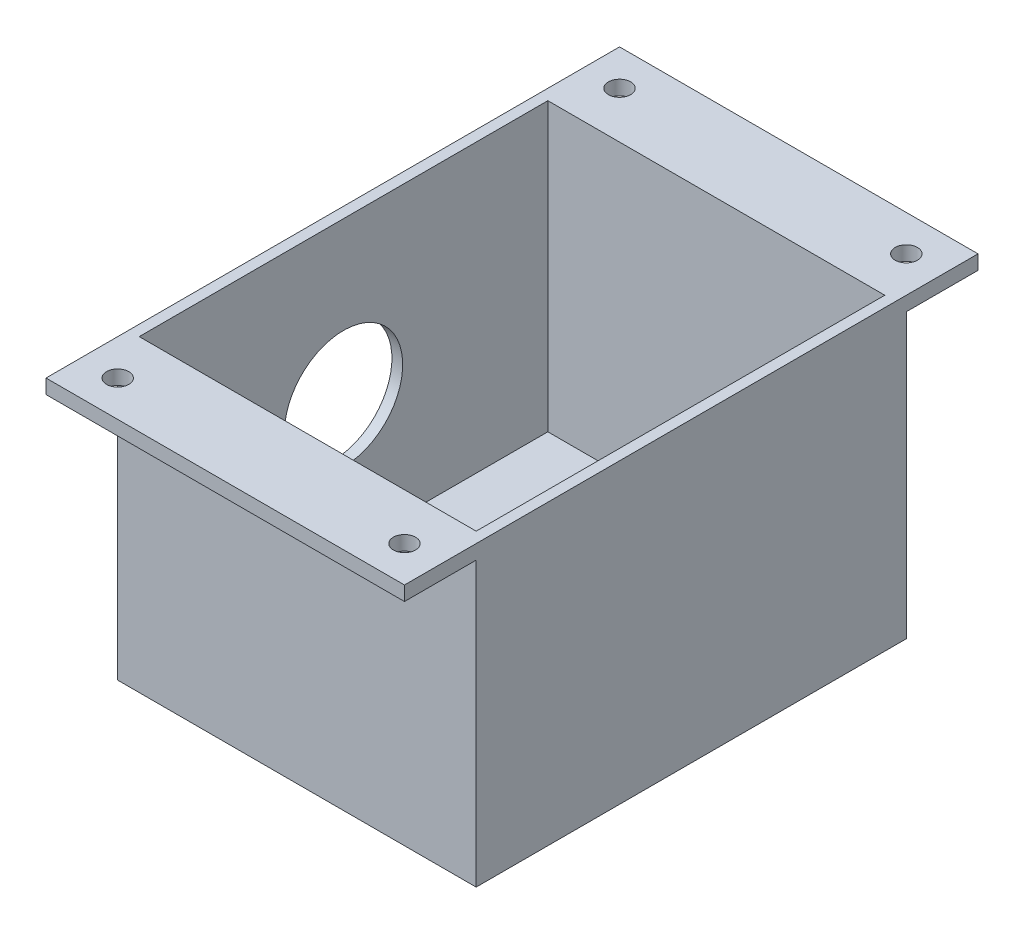
ISO-10303-21;
HEADER;
FILE_DESCRIPTION(('STEP AP214'),'2;1');
FILE_NAME('part.step','',(''),(''),'','','');
FILE_SCHEMA(('AUTOMOTIVE_DESIGN { 1 0 10303 214 1 1 1 1 }'));
ENDSEC;
DATA;
#1=APPLICATION_CONTEXT('core data for automotive mechanical design processes');
#2=APPLICATION_PROTOCOL_DEFINITION('international standard','automotive_design',2000,#1);
#3=PRODUCT_CONTEXT('',#1,'mechanical');
#4=PRODUCT('Part','Part','',(#3));
#5=PRODUCT_RELATED_PRODUCT_CATEGORY('part','',(#4));
#6=PRODUCT_DEFINITION_FORMATION('','',#4);
#7=PRODUCT_DEFINITION_CONTEXT('part definition',#1,'design');
#8=PRODUCT_DEFINITION('design','',#6,#7);
#9=PRODUCT_DEFINITION_SHAPE('','',#8);
#10=(LENGTH_UNIT() NAMED_UNIT(*) SI_UNIT(.MILLI.,.METRE.));
#11=(NAMED_UNIT(*) PLANE_ANGLE_UNIT() SI_UNIT($,.RADIAN.));
#12=(NAMED_UNIT(*) SI_UNIT($,.STERADIAN.) SOLID_ANGLE_UNIT());
#13=UNCERTAINTY_MEASURE_WITH_UNIT(LENGTH_MEASURE(1.E-05),#10,'distance_accuracy_value','');
#14=(GEOMETRIC_REPRESENTATION_CONTEXT(3) GLOBAL_UNCERTAINTY_ASSIGNED_CONTEXT((#13)) GLOBAL_UNIT_ASSIGNED_CONTEXT((#10,
#11,#12)) REPRESENTATION_CONTEXT('',''));
#15=CARTESIAN_POINT('',(0.,0.,0.));
#16=DIRECTION('',(0.,0.,1.));
#17=DIRECTION('',(1.,0.,0.));
#18=AXIS2_PLACEMENT_3D('',#15,#16,#17);
#19=CARTESIAN_POINT('',(0.,40.,-30.));
#20=DIRECTION('',(0.,0.,-1.));
#21=DIRECTION('',(-1.,0.,0.));
#22=AXIS2_PLACEMENT_3D('',#19,#20,#21);
#23=PLANE('',#22);
#24=DIRECTION('',(0.,-1.,0.));
#25=VECTOR('',#24,1.);
#26=CARTESIAN_POINT('',(-25.,40.,-30.));
#27=LINE('',#26,#25);
#28=CARTESIAN_POINT('',(-25.,38.,-30.));
#29=VERTEX_POINT('',#28);
#30=CARTESIAN_POINT('',(-25.,-1.5,-30.));
#31=VERTEX_POINT('',#30);
#32=EDGE_CURVE('E11',#29,#31,#27,.T.);
#33=ORIENTED_EDGE('',*,*,#32,.F.);
#34=DIRECTION('',(1.,0.,0.));
#35=VECTOR('',#34,1.);
#36=CARTESIAN_POINT('',(-25.,38.,-30.));
#37=LINE('',#36,#35);
#38=CARTESIAN_POINT('',(25.,38.,-30.));
#39=VERTEX_POINT('',#38);
#40=EDGE_CURVE('E164',#29,#39,#37,.T.);
#41=ORIENTED_EDGE('',*,*,#40,.T.);
#42=DIRECTION('',(0.,-1.,0.));
#43=VECTOR('',#42,1.);
#44=CARTESIAN_POINT('',(25.,40.,-30.));
#45=LINE('',#44,#43);
#46=CARTESIAN_POINT('',(25.,-1.5,-30.));
#47=VERTEX_POINT('',#46);
#48=EDGE_CURVE('E214',#39,#47,#45,.T.);
#49=ORIENTED_EDGE('',*,*,#48,.T.);
#50=DIRECTION('',(1.,0.,0.));
#51=VECTOR('',#50,1.);
#52=CARTESIAN_POINT('',(-25.,-1.5,-30.));
#53=LINE('',#52,#51);
#54=EDGE_CURVE('E183',#31,#47,#53,.T.);
#55=ORIENTED_EDGE('',*,*,#54,.F.);
#56=EDGE_LOOP('',(#33,#41,#49,#55));
#57=FACE_BOUND('',#56,.T.);
#58=ADVANCED_FACE('F42',(#57),#23,.T.);
#59=CARTESIAN_POINT('',(0.,40.,30.));
#60=DIRECTION('',(0.,0.,-1.));
#61=DIRECTION('',(-1.,0.,0.));
#62=AXIS2_PLACEMENT_3D('',#59,#60,#61);
#63=PLANE('',#62);
#64=DIRECTION('',(1.,0.,0.));
#65=VECTOR('',#64,1.);
#66=CARTESIAN_POINT('',(-25.,38.,30.));
#67=LINE('',#66,#65);
#68=CARTESIAN_POINT('',(-25.,38.,30.));
#69=VERTEX_POINT('',#68);
#70=CARTESIAN_POINT('',(25.,38.,30.));
#71=VERTEX_POINT('',#70);
#72=EDGE_CURVE('E67',#69,#71,#67,.T.);
#73=ORIENTED_EDGE('',*,*,#72,.F.);
#74=DIRECTION('',(0.,-1.,0.));
#75=VECTOR('',#74,1.);
#76=CARTESIAN_POINT('',(-25.,40.,30.));
#77=LINE('',#76,#75);
#78=CARTESIAN_POINT('',(-25.,-1.5,30.));
#79=VERTEX_POINT('',#78);
#80=EDGE_CURVE('E51',#69,#79,#77,.T.);
#81=ORIENTED_EDGE('',*,*,#80,.T.);
#82=DIRECTION('',(-1.,0.,0.));
#83=VECTOR('',#82,1.);
#84=CARTESIAN_POINT('',(-25.,-1.5,30.));
#85=LINE('',#84,#83);
#86=CARTESIAN_POINT('',(25.,-1.5,30.));
#87=VERTEX_POINT('',#86);
#88=EDGE_CURVE('E189',#87,#79,#85,.T.);
#89=ORIENTED_EDGE('',*,*,#88,.F.);
#90=DIRECTION('',(0.,-1.,0.));
#91=VECTOR('',#90,1.);
#92=CARTESIAN_POINT('',(25.,40.,30.));
#93=LINE('',#92,#91);
#94=EDGE_CURVE('E216',#71,#87,#93,.T.);
#95=ORIENTED_EDGE('',*,*,#94,.F.);
#96=EDGE_LOOP('',(#73,#81,#89,#95));
#97=FACE_BOUND('',#96,.T.);
#98=ADVANCED_FACE('F260',(#97),#63,.F.);
#99=CARTESIAN_POINT('',(-25.,40.,0.));
#100=DIRECTION('',(-1.,0.,0.));
#101=DIRECTION('',(0.,0.,1.));
#102=AXIS2_PLACEMENT_3D('',#99,#100,#101);
#103=PLANE('',#102);
#104=CARTESIAN_POINT('',(-25.,18.25,0.));
#105=DIRECTION('',(-1.,0.,0.));
#106=DIRECTION('',(0.,0.,1.));
#107=AXIS2_PLACEMENT_3D('',#104,#105,#106);
#108=CIRCLE('',#107,8.25);
#109=CARTESIAN_POINT('',(-25.,18.25,8.25));
#110=VERTEX_POINT('',#109);
#111=EDGE_CURVE('E280',#110,#110,#108,.T.);
#112=ORIENTED_EDGE('',*,*,#111,.F.);
#113=EDGE_LOOP('',(#112));
#114=FACE_BOUND('',#113,.T.);
#115=DIRECTION('',(0.,0.,-1.));
#116=VECTOR('',#115,1.);
#117=CARTESIAN_POINT('',(-25.,40.,0.));
#118=LINE('',#117,#116);
#119=CARTESIAN_POINT('',(-25.,40.,40.));
#120=VERTEX_POINT('',#119);
#121=CARTESIAN_POINT('',(-25.,40.,-40.));
#122=VERTEX_POINT('',#121);
#123=EDGE_CURVE('E144',#120,#122,#118,.T.);
#124=ORIENTED_EDGE('',*,*,#123,.T.);
#125=DIRECTION('',(0.,1.,0.));
#126=VECTOR('',#125,1.);
#127=CARTESIAN_POINT('',(-25.,40.,-40.));
#128=LINE('',#127,#126);
#129=CARTESIAN_POINT('',(-25.,38.,-40.));
#130=VERTEX_POINT('',#129);
#131=EDGE_CURVE('E151',#130,#122,#128,.T.);
#132=ORIENTED_EDGE('',*,*,#131,.F.);
#133=DIRECTION('',(0.,0.,-1.));
#134=VECTOR('',#133,1.);
#135=CARTESIAN_POINT('',(-25.,38.,-30.));
#136=LINE('',#135,#134);
#137=EDGE_CURVE('E156',#29,#130,#136,.T.);
#138=ORIENTED_EDGE('',*,*,#137,.F.);
#139=ORIENTED_EDGE('',*,*,#32,.T.);
#140=DIRECTION('',(0.,0.,-1.));
#141=VECTOR('',#140,1.);
#142=CARTESIAN_POINT('',(-25.,-1.5,30.));
#143=LINE('',#142,#141);
#144=EDGE_CURVE('E177',#79,#31,#143,.T.);
#145=ORIENTED_EDGE('',*,*,#144,.F.);
#146=ORIENTED_EDGE('',*,*,#80,.F.);
#147=DIRECTION('',(0.,0.,-1.));
#148=VECTOR('',#147,1.);
#149=CARTESIAN_POINT('',(-25.,38.,30.));
#150=LINE('',#149,#148);
#151=CARTESIAN_POINT('',(-25.,38.,40.));
#152=VERTEX_POINT('',#151);
#153=EDGE_CURVE('E169',#152,#69,#150,.T.);
#154=ORIENTED_EDGE('',*,*,#153,.F.);
#155=DIRECTION('',(0.,-1.,0.));
#156=VECTOR('',#155,1.);
#157=CARTESIAN_POINT('',(-25.,40.,40.));
#158=LINE('',#157,#156);
#159=EDGE_CURVE('E166',#120,#152,#158,.T.);
#160=ORIENTED_EDGE('',*,*,#159,.F.);
#161=EDGE_LOOP('',(#124,#132,#138,#139,#145,#146,#154,#160));
#162=FACE_BOUND('',#161,.T.);
#163=ADVANCED_FACE('F257',(#114,#162),#103,.T.);
#164=CARTESIAN_POINT('',(23.5,40.,0.));
#165=DIRECTION('',(-1.,0.,0.));
#166=DIRECTION('',(0.,0.,1.));
#167=AXIS2_PLACEMENT_3D('',#164,#165,#166);
#168=PLANE('',#167);
#169=DIRECTION('',(0.,0.,-1.));
#170=VECTOR('',#169,1.);
#171=CARTESIAN_POINT('',(23.5,0.,0.));
#172=LINE('',#171,#170);
#173=CARTESIAN_POINT('',(23.5,0.,28.5));
#174=VERTEX_POINT('',#173);
#175=CARTESIAN_POINT('',(23.5,0.,-28.5));
#176=VERTEX_POINT('',#175);
#177=EDGE_CURVE('E192',#174,#176,#172,.T.);
#178=ORIENTED_EDGE('',*,*,#177,.F.);
#179=DIRECTION('',(0.,-1.,0.));
#180=VECTOR('',#179,1.);
#181=CARTESIAN_POINT('',(23.5,40.,28.5));
#182=LINE('',#181,#180);
#183=CARTESIAN_POINT('',(23.5,40.,28.5));
#184=VERTEX_POINT('',#183);
#185=EDGE_CURVE('E217',#184,#174,#182,.T.);
#186=ORIENTED_EDGE('',*,*,#185,.F.);
#187=DIRECTION('',(0.,0.,-1.));
#188=VECTOR('',#187,1.);
#189=CARTESIAN_POINT('',(23.5,40.,0.));
#190=LINE('',#189,#188);
#191=CARTESIAN_POINT('',(23.5,40.,-28.5));
#192=VERTEX_POINT('',#191);
#193=EDGE_CURVE('E193',#184,#192,#190,.T.);
#194=ORIENTED_EDGE('',*,*,#193,.T.);
#195=DIRECTION('',(0.,-1.,0.));
#196=VECTOR('',#195,1.);
#197=CARTESIAN_POINT('',(23.5,40.,-28.5));
#198=LINE('',#197,#196);
#199=EDGE_CURVE('E143',#192,#176,#198,.T.);
#200=ORIENTED_EDGE('',*,*,#199,.T.);
#201=EDGE_LOOP('',(#178,#186,#194,#200));
#202=FACE_BOUND('',#201,.T.);
#203=ADVANCED_FACE('F44',(#202),#168,.T.);
#204=CARTESIAN_POINT('',(0.,40.,28.5));
#205=DIRECTION('',(0.,0.,-1.));
#206=DIRECTION('',(-1.,0.,0.));
#207=AXIS2_PLACEMENT_3D('',#204,#205,#206);
#208=PLANE('',#207);
#209=DIRECTION('',(1.,0.,0.));
#210=VECTOR('',#209,1.);
#211=CARTESIAN_POINT('',(0.,0.,28.5));
#212=LINE('',#211,#210);
#213=CARTESIAN_POINT('',(-23.5,0.,28.5));
#214=VERTEX_POINT('',#213);
#215=EDGE_CURVE('E207',#214,#174,#212,.T.);
#216=ORIENTED_EDGE('',*,*,#215,.F.);
#217=DIRECTION('',(0.,-1.,0.));
#218=VECTOR('',#217,1.);
#219=CARTESIAN_POINT('',(-23.5,40.,28.5));
#220=LINE('',#219,#218);
#221=CARTESIAN_POINT('',(-23.5,40.,28.5));
#222=VERTEX_POINT('',#221);
#223=EDGE_CURVE('E224',#222,#214,#220,.T.);
#224=ORIENTED_EDGE('',*,*,#223,.F.);
#225=DIRECTION('',(1.,0.,0.));
#226=VECTOR('',#225,1.);
#227=CARTESIAN_POINT('',(0.,40.,28.5));
#228=LINE('',#227,#226);
#229=EDGE_CURVE('E196',#222,#184,#228,.T.);
#230=ORIENTED_EDGE('',*,*,#229,.T.);
#231=ORIENTED_EDGE('',*,*,#185,.T.);
#232=EDGE_LOOP('',(#216,#224,#230,#231));
#233=FACE_BOUND('',#232,.T.);
#234=ADVANCED_FACE('F302',(#233),#208,.T.);
#235=CARTESIAN_POINT('',(-23.5,40.,0.));
#236=DIRECTION('',(-1.,0.,0.));
#237=DIRECTION('',(0.,0.,1.));
#238=AXIS2_PLACEMENT_3D('',#235,#236,#237);
#239=PLANE('',#238);
#240=CARTESIAN_POINT('',(-23.5,18.25,0.));
#241=DIRECTION('',(-1.,0.,0.));
#242=DIRECTION('',(0.,0.,1.));
#243=AXIS2_PLACEMENT_3D('',#240,#241,#242);
#244=CIRCLE('',#243,8.25);
#245=CARTESIAN_POINT('',(-23.5,18.25,8.25));
#246=VERTEX_POINT('',#245);
#247=EDGE_CURVE('E275',#246,#246,#244,.T.);
#248=ORIENTED_EDGE('',*,*,#247,.T.);
#249=EDGE_LOOP('',(#248));
#250=FACE_BOUND('',#249,.T.);
#251=DIRECTION('',(0.,0.,-1.));
#252=VECTOR('',#251,1.);
#253=CARTESIAN_POINT('',(-23.5,0.,0.));
#254=LINE('',#253,#252);
#255=CARTESIAN_POINT('',(-23.5,0.,-28.5));
#256=VERTEX_POINT('',#255);
#257=EDGE_CURVE('E210',#214,#256,#254,.T.);
#258=ORIENTED_EDGE('',*,*,#257,.T.);
#259=DIRECTION('',(0.,-1.,0.));
#260=VECTOR('',#259,1.);
#261=CARTESIAN_POINT('',(-23.5,40.,-28.5));
#262=LINE('',#261,#260);
#263=CARTESIAN_POINT('',(-23.5,40.,-28.5));
#264=VERTEX_POINT('',#263);
#265=EDGE_CURVE('E221',#264,#256,#262,.T.);
#266=ORIENTED_EDGE('',*,*,#265,.F.);
#267=DIRECTION('',(0.,0.,-1.));
#268=VECTOR('',#267,1.);
#269=CARTESIAN_POINT('',(-23.5,40.,0.));
#270=LINE('',#269,#268);
#271=EDGE_CURVE('E200',#222,#264,#270,.T.);
#272=ORIENTED_EDGE('',*,*,#271,.F.);
#273=ORIENTED_EDGE('',*,*,#223,.T.);
#274=EDGE_LOOP('',(#258,#266,#272,#273));
#275=FACE_BOUND('',#274,.T.);
#276=ADVANCED_FACE('F286',(#250,#275),#239,.F.);
#277=CARTESIAN_POINT('',(0.,40.,-28.5));
#278=DIRECTION('',(0.,0.,-1.));
#279=DIRECTION('',(-1.,0.,0.));
#280=AXIS2_PLACEMENT_3D('',#277,#278,#279);
#281=PLANE('',#280);
#282=DIRECTION('',(1.,0.,0.));
#283=VECTOR('',#282,1.);
#284=CARTESIAN_POINT('',(0.,0.,-28.5));
#285=LINE('',#284,#283);
#286=EDGE_CURVE('E197',#256,#176,#285,.T.);
#287=ORIENTED_EDGE('',*,*,#286,.T.);
#288=ORIENTED_EDGE('',*,*,#199,.F.);
#289=DIRECTION('',(1.,0.,0.));
#290=VECTOR('',#289,1.);
#291=CARTESIAN_POINT('',(0.,40.,-28.5));
#292=LINE('',#291,#290);
#293=EDGE_CURVE('E202',#264,#192,#292,.T.);
#294=ORIENTED_EDGE('',*,*,#293,.F.);
#295=ORIENTED_EDGE('',*,*,#265,.T.);
#296=EDGE_LOOP('',(#287,#288,#294,#295));
#297=FACE_BOUND('',#296,.T.);
#298=ADVANCED_FACE('F311',(#297),#281,.F.);
#299=CARTESIAN_POINT('',(25.,40.,0.));
#300=DIRECTION('',(-1.,0.,0.));
#301=DIRECTION('',(0.,0.,1.));
#302=AXIS2_PLACEMENT_3D('',#299,#300,#301);
#303=PLANE('',#302);
#304=DIRECTION('',(0.,0.,-1.));
#305=VECTOR('',#304,1.);
#306=CARTESIAN_POINT('',(25.,40.,0.));
#307=LINE('',#306,#305);
#308=CARTESIAN_POINT('',(25.,40.,40.));
#309=VERTEX_POINT('',#308);
#310=CARTESIAN_POINT('',(25.,40.,-40.));
#311=VERTEX_POINT('',#310);
#312=EDGE_CURVE('E132',#309,#311,#307,.T.);
#313=ORIENTED_EDGE('',*,*,#312,.F.);
#314=DIRECTION('',(0.,-1.,0.));
#315=VECTOR('',#314,1.);
#316=CARTESIAN_POINT('',(25.,40.,40.));
#317=LINE('',#316,#315);
#318=CARTESIAN_POINT('',(25.,38.,40.));
#319=VERTEX_POINT('',#318);
#320=EDGE_CURVE('E158',#309,#319,#317,.T.);
#321=ORIENTED_EDGE('',*,*,#320,.T.);
#322=DIRECTION('',(0.,0.,-1.));
#323=VECTOR('',#322,1.);
#324=CARTESIAN_POINT('',(25.,38.,30.));
#325=LINE('',#324,#323);
#326=EDGE_CURVE('E170',#319,#71,#325,.T.);
#327=ORIENTED_EDGE('',*,*,#326,.T.);
#328=ORIENTED_EDGE('',*,*,#94,.T.);
#329=DIRECTION('',(0.,0.,1.));
#330=VECTOR('',#329,1.);
#331=CARTESIAN_POINT('',(25.,-1.5,30.));
#332=LINE('',#331,#330);
#333=EDGE_CURVE('E186',#47,#87,#332,.T.);
#334=ORIENTED_EDGE('',*,*,#333,.F.);
#335=ORIENTED_EDGE('',*,*,#48,.F.);
#336=DIRECTION('',(0.,0.,-1.));
#337=VECTOR('',#336,1.);
#338=CARTESIAN_POINT('',(25.,38.,-30.));
#339=LINE('',#338,#337);
#340=CARTESIAN_POINT('',(25.,38.,-40.));
#341=VERTEX_POINT('',#340);
#342=EDGE_CURVE('E59',#39,#341,#339,.T.);
#343=ORIENTED_EDGE('',*,*,#342,.T.);
#344=DIRECTION('',(0.,1.,0.));
#345=VECTOR('',#344,1.);
#346=CARTESIAN_POINT('',(25.,40.,-40.));
#347=LINE('',#346,#345);
#348=EDGE_CURVE('E149',#341,#311,#347,.T.);
#349=ORIENTED_EDGE('',*,*,#348,.T.);
#350=EDGE_LOOP('',(#313,#321,#327,#328,#334,#335,#343,#349));
#351=FACE_BOUND('',#350,.T.);
#352=ADVANCED_FACE('F154',(#351),#303,.F.);
#353=CARTESIAN_POINT('',(0.,40.,0.));
#354=DIRECTION('',(0.,1.,0.));
#355=DIRECTION('',(0.,0.,1.));
#356=AXIS2_PLACEMENT_3D('',#353,#354,#355);
#357=PLANE('',#356);
#358=CARTESIAN_POINT('',(-20.,40.,35.));
#359=DIRECTION('',(0.,1.,0.));
#360=DIRECTION('',(0.,0.,1.));
#361=AXIS2_PLACEMENT_3D('',#358,#359,#360);
#362=CIRCLE('',#361,1.55);
#363=CARTESIAN_POINT('',(-20.,40.,36.55));
#364=VERTEX_POINT('',#363);
#365=EDGE_CURVE('E271',#364,#364,#362,.T.);
#366=ORIENTED_EDGE('',*,*,#365,.F.);
#367=EDGE_LOOP('',(#366));
#368=FACE_BOUND('',#367,.T.);
#369=CARTESIAN_POINT('',(20.,40.,35.));
#370=DIRECTION('',(0.,1.,0.));
#371=DIRECTION('',(0.,0.,1.));
#372=AXIS2_PLACEMENT_3D('',#369,#370,#371);
#373=CIRCLE('',#372,1.55);
#374=CARTESIAN_POINT('',(20.,40.,36.55));
#375=VERTEX_POINT('',#374);
#376=EDGE_CURVE('E274',#375,#375,#373,.T.);
#377=ORIENTED_EDGE('',*,*,#376,.F.);
#378=EDGE_LOOP('',(#377));
#379=FACE_BOUND('',#378,.T.);
#380=CARTESIAN_POINT('',(20.,40.,-35.));
#381=DIRECTION('',(0.,1.,0.));
#382=DIRECTION('',(0.,0.,1.));
#383=AXIS2_PLACEMENT_3D('',#380,#381,#382);
#384=CIRCLE('',#383,1.55);
#385=CARTESIAN_POINT('',(20.,40.,-33.45));
#386=VERTEX_POINT('',#385);
#387=EDGE_CURVE('E270',#386,#386,#384,.T.);
#388=ORIENTED_EDGE('',*,*,#387,.F.);
#389=EDGE_LOOP('',(#388));
#390=FACE_BOUND('',#389,.T.);
#391=CARTESIAN_POINT('',(-20.,40.,-35.));
#392=DIRECTION('',(0.,1.,0.));
#393=DIRECTION('',(0.,0.,1.));
#394=AXIS2_PLACEMENT_3D('',#391,#392,#393);
#395=CIRCLE('',#394,1.55);
#396=CARTESIAN_POINT('',(-20.,40.,-33.45));
#397=VERTEX_POINT('',#396);
#398=EDGE_CURVE('E232',#397,#397,#395,.T.);
#399=ORIENTED_EDGE('',*,*,#398,.F.);
#400=EDGE_LOOP('',(#399));
#401=FACE_BOUND('',#400,.T.);
#402=ORIENTED_EDGE('',*,*,#193,.F.);
#403=ORIENTED_EDGE('',*,*,#229,.F.);
#404=ORIENTED_EDGE('',*,*,#271,.T.);
#405=ORIENTED_EDGE('',*,*,#293,.T.);
#406=EDGE_LOOP('',(#402,#403,#404,#405));
#407=FACE_BOUND('',#406,.T.);
#408=ORIENTED_EDGE('',*,*,#312,.T.);
#409=DIRECTION('',(1.,0.,0.));
#410=VECTOR('',#409,1.);
#411=CARTESIAN_POINT('',(-25.,40.,-40.));
#412=LINE('',#411,#410);
#413=EDGE_CURVE('E135',#122,#311,#412,.T.);
#414=ORIENTED_EDGE('',*,*,#413,.F.);
#415=ORIENTED_EDGE('',*,*,#123,.F.);
#416=DIRECTION('',(1.,0.,0.));
#417=VECTOR('',#416,1.);
#418=CARTESIAN_POINT('',(-25.,40.,40.));
#419=LINE('',#418,#417);
#420=EDGE_CURVE('E138',#120,#309,#419,.T.);
#421=ORIENTED_EDGE('',*,*,#420,.T.);
#422=EDGE_LOOP('',(#408,#414,#415,#421));
#423=FACE_BOUND('',#422,.T.);
#424=ADVANCED_FACE('F134',(#368,#379,#390,#401,#407,#423),#357,.T.);
#425=CARTESIAN_POINT('',(0.,0.,0.));
#426=DIRECTION('',(0.,-1.,0.));
#427=DIRECTION('',(0.,0.,-1.));
#428=AXIS2_PLACEMENT_3D('',#425,#426,#427);
#429=PLANE('',#428);
#430=ORIENTED_EDGE('',*,*,#215,.T.);
#431=ORIENTED_EDGE('',*,*,#177,.T.);
#432=ORIENTED_EDGE('',*,*,#286,.F.);
#433=ORIENTED_EDGE('',*,*,#257,.F.);
#434=EDGE_LOOP('',(#430,#431,#432,#433));
#435=FACE_BOUND('',#434,.T.);
#436=ADVANCED_FACE('F325',(#435),#429,.F.);
#437=CARTESIAN_POINT('',(0.,-1.5,0.));
#438=DIRECTION('',(0.,-1.,0.));
#439=DIRECTION('',(0.,0.,-1.));
#440=AXIS2_PLACEMENT_3D('',#437,#438,#439);
#441=PLANE('',#440);
#442=ORIENTED_EDGE('',*,*,#144,.T.);
#443=ORIENTED_EDGE('',*,*,#54,.T.);
#444=ORIENTED_EDGE('',*,*,#333,.T.);
#445=ORIENTED_EDGE('',*,*,#88,.T.);
#446=EDGE_LOOP('',(#442,#443,#444,#445));
#447=FACE_BOUND('',#446,.T.);
#448=ADVANCED_FACE('F248',(#447),#441,.T.);
#449=CARTESIAN_POINT('',(-25.,38.,30.));
#450=DIRECTION('',(0.,-1.,0.));
#451=DIRECTION('',(0.,0.,-1.));
#452=AXIS2_PLACEMENT_3D('',#449,#450,#451);
#453=PLANE('',#452);
#454=CARTESIAN_POINT('',(-20.,38.,35.));
#455=DIRECTION('',(0.,-1.,0.));
#456=DIRECTION('',(0.,0.,-1.));
#457=AXIS2_PLACEMENT_3D('',#454,#455,#456);
#458=CIRCLE('',#457,1.55);
#459=CARTESIAN_POINT('',(-20.,38.,33.45));
#460=VERTEX_POINT('',#459);
#461=EDGE_CURVE('E46',#460,#460,#458,.T.);
#462=ORIENTED_EDGE('',*,*,#461,.F.);
#463=EDGE_LOOP('',(#462));
#464=FACE_BOUND('',#463,.T.);
#465=CARTESIAN_POINT('',(20.,38.,35.));
#466=DIRECTION('',(0.,-1.,0.));
#467=DIRECTION('',(0.,0.,-1.));
#468=AXIS2_PLACEMENT_3D('',#465,#466,#467);
#469=CIRCLE('',#468,1.55);
#470=CARTESIAN_POINT('',(20.,38.,33.45));
#471=VERTEX_POINT('',#470);
#472=EDGE_CURVE('E234',#471,#471,#469,.T.);
#473=ORIENTED_EDGE('',*,*,#472,.F.);
#474=EDGE_LOOP('',(#473));
#475=FACE_BOUND('',#474,.T.);
#476=ORIENTED_EDGE('',*,*,#326,.F.);
#477=DIRECTION('',(1.,0.,0.));
#478=VECTOR('',#477,1.);
#479=CARTESIAN_POINT('',(-25.,38.,40.));
#480=LINE('',#479,#478);
#481=EDGE_CURVE('E178',#152,#319,#480,.T.);
#482=ORIENTED_EDGE('',*,*,#481,.F.);
#483=ORIENTED_EDGE('',*,*,#153,.T.);
#484=ORIENTED_EDGE('',*,*,#72,.T.);
#485=EDGE_LOOP('',(#476,#482,#483,#484));
#486=FACE_BOUND('',#485,.T.);
#487=ADVANCED_FACE('F244',(#464,#475,#486),#453,.T.);
#488=CARTESIAN_POINT('',(-25.,40.,40.));
#489=DIRECTION('',(0.,0.,1.));
#490=DIRECTION('',(1.,0.,0.));
#491=AXIS2_PLACEMENT_3D('',#488,#489,#490);
#492=PLANE('',#491);
#493=ORIENTED_EDGE('',*,*,#320,.F.);
#494=ORIENTED_EDGE('',*,*,#420,.F.);
#495=ORIENTED_EDGE('',*,*,#159,.T.);
#496=ORIENTED_EDGE('',*,*,#481,.T.);
#497=EDGE_LOOP('',(#493,#494,#495,#496));
#498=FACE_BOUND('',#497,.T.);
#499=ADVANCED_FACE('F247',(#498),#492,.T.);
#500=CARTESIAN_POINT('',(-25.,40.,-40.));
#501=DIRECTION('',(0.,0.,-1.));
#502=DIRECTION('',(-1.,0.,0.));
#503=AXIS2_PLACEMENT_3D('',#500,#501,#502);
#504=PLANE('',#503);
#505=ORIENTED_EDGE('',*,*,#348,.F.);
#506=DIRECTION('',(1.,0.,0.));
#507=VECTOR('',#506,1.);
#508=CARTESIAN_POINT('',(-25.,38.,-40.));
#509=LINE('',#508,#507);
#510=EDGE_CURVE('E152',#130,#341,#509,.T.);
#511=ORIENTED_EDGE('',*,*,#510,.F.);
#512=ORIENTED_EDGE('',*,*,#131,.T.);
#513=ORIENTED_EDGE('',*,*,#413,.T.);
#514=EDGE_LOOP('',(#505,#511,#512,#513));
#515=FACE_BOUND('',#514,.T.);
#516=ADVANCED_FACE('F148',(#515),#504,.T.);
#517=CARTESIAN_POINT('',(-25.,38.,-30.));
#518=DIRECTION('',(0.,-1.,0.));
#519=DIRECTION('',(0.,0.,-1.));
#520=AXIS2_PLACEMENT_3D('',#517,#518,#519);
#521=PLANE('',#520);
#522=CARTESIAN_POINT('',(20.,38.,-35.));
#523=DIRECTION('',(0.,-1.,0.));
#524=DIRECTION('',(0.,0.,-1.));
#525=AXIS2_PLACEMENT_3D('',#522,#523,#524);
#526=CIRCLE('',#525,1.55);
#527=CARTESIAN_POINT('',(20.,38.,-36.55));
#528=VERTEX_POINT('',#527);
#529=EDGE_CURVE('E231',#528,#528,#526,.T.);
#530=ORIENTED_EDGE('',*,*,#529,.F.);
#531=EDGE_LOOP('',(#530));
#532=FACE_BOUND('',#531,.T.);
#533=CARTESIAN_POINT('',(-20.,38.,-35.));
#534=DIRECTION('',(0.,-1.,0.));
#535=DIRECTION('',(0.,0.,-1.));
#536=AXIS2_PLACEMENT_3D('',#533,#534,#535);
#537=CIRCLE('',#536,1.55);
#538=CARTESIAN_POINT('',(-20.,38.,-36.55));
#539=VERTEX_POINT('',#538);
#540=EDGE_CURVE('E228',#539,#539,#537,.T.);
#541=ORIENTED_EDGE('',*,*,#540,.F.);
#542=EDGE_LOOP('',(#541));
#543=FACE_BOUND('',#542,.T.);
#544=ORIENTED_EDGE('',*,*,#342,.F.);
#545=ORIENTED_EDGE('',*,*,#40,.F.);
#546=ORIENTED_EDGE('',*,*,#137,.T.);
#547=ORIENTED_EDGE('',*,*,#510,.T.);
#548=EDGE_LOOP('',(#544,#545,#546,#547));
#549=FACE_BOUND('',#548,.T.);
#550=ADVANCED_FACE('F350',(#532,#543,#549),#521,.T.);
#551=CARTESIAN_POINT('',(-20.,37.,-35.));
#552=DIRECTION('',(0.,1.,0.));
#553=DIRECTION('',(0.,0.,1.));
#554=AXIS2_PLACEMENT_3D('',#551,#552,#553);
#555=CYLINDRICAL_SURFACE('',#554,1.55);
#556=ORIENTED_EDGE('',*,*,#540,.T.);
#557=EDGE_LOOP('',(#556));
#558=FACE_BOUND('',#557,.T.);
#559=ORIENTED_EDGE('',*,*,#398,.T.);
#560=EDGE_LOOP('',(#559));
#561=FACE_BOUND('',#560,.T.);
#562=ADVANCED_FACE('F353',(#558,#561),#555,.F.);
#563=CARTESIAN_POINT('',(20.,37.,-35.));
#564=DIRECTION('',(0.,1.,0.));
#565=DIRECTION('',(0.,0.,1.));
#566=AXIS2_PLACEMENT_3D('',#563,#564,#565);
#567=CYLINDRICAL_SURFACE('',#566,1.55);
#568=ORIENTED_EDGE('',*,*,#529,.T.);
#569=EDGE_LOOP('',(#568));
#570=FACE_BOUND('',#569,.T.);
#571=ORIENTED_EDGE('',*,*,#387,.T.);
#572=EDGE_LOOP('',(#571));
#573=FACE_BOUND('',#572,.T.);
#574=ADVANCED_FACE('F357',(#570,#573),#567,.F.);
#575=CARTESIAN_POINT('',(20.,37.,35.));
#576=DIRECTION('',(0.,1.,0.));
#577=DIRECTION('',(0.,0.,1.));
#578=AXIS2_PLACEMENT_3D('',#575,#576,#577);
#579=CYLINDRICAL_SURFACE('',#578,1.55);
#580=ORIENTED_EDGE('',*,*,#472,.T.);
#581=EDGE_LOOP('',(#580));
#582=FACE_BOUND('',#581,.T.);
#583=ORIENTED_EDGE('',*,*,#376,.T.);
#584=EDGE_LOOP('',(#583));
#585=FACE_BOUND('',#584,.T.);
#586=ADVANCED_FACE('F361',(#582,#585),#579,.F.);
#587=CARTESIAN_POINT('',(-20.,37.,35.));
#588=DIRECTION('',(0.,1.,0.));
#589=DIRECTION('',(0.,0.,1.));
#590=AXIS2_PLACEMENT_3D('',#587,#588,#589);
#591=CYLINDRICAL_SURFACE('',#590,1.55);
#592=ORIENTED_EDGE('',*,*,#461,.T.);
#593=EDGE_LOOP('',(#592));
#594=FACE_BOUND('',#593,.T.);
#595=ORIENTED_EDGE('',*,*,#365,.T.);
#596=EDGE_LOOP('',(#595));
#597=FACE_BOUND('',#596,.T.);
#598=ADVANCED_FACE('F241',(#594,#597),#591,.F.);
#599=CARTESIAN_POINT('',(-23.5,18.25,0.));
#600=DIRECTION('',(-1.,0.,0.));
#601=DIRECTION('',(0.,0.,1.));
#602=AXIS2_PLACEMENT_3D('',#599,#600,#601);
#603=CYLINDRICAL_SURFACE('',#602,8.25);
#604=ORIENTED_EDGE('',*,*,#247,.F.);
#605=EDGE_LOOP('',(#604));
#606=FACE_BOUND('',#605,.T.);
#607=ORIENTED_EDGE('',*,*,#111,.T.);
#608=EDGE_LOOP('',(#607));
#609=FACE_BOUND('',#608,.T.);
#610=ADVANCED_FACE('F289',(#606,#609),#603,.F.);
#611=CLOSED_SHELL('',(#58,#98,#163,#203,#234,#276,#298,#352,#424,#436,#448,#487,#499,#516,#550,
#562,#574,#586,#598,#610));
#612=MANIFOLD_SOLID_BREP('B2',#611);
#613=ADVANCED_BREP_SHAPE_REPRESENTATION('',(#18,#612),#14);
#614=SHAPE_DEFINITION_REPRESENTATION(#9,#613);
ENDSEC;
END-ISO-10303-21;
